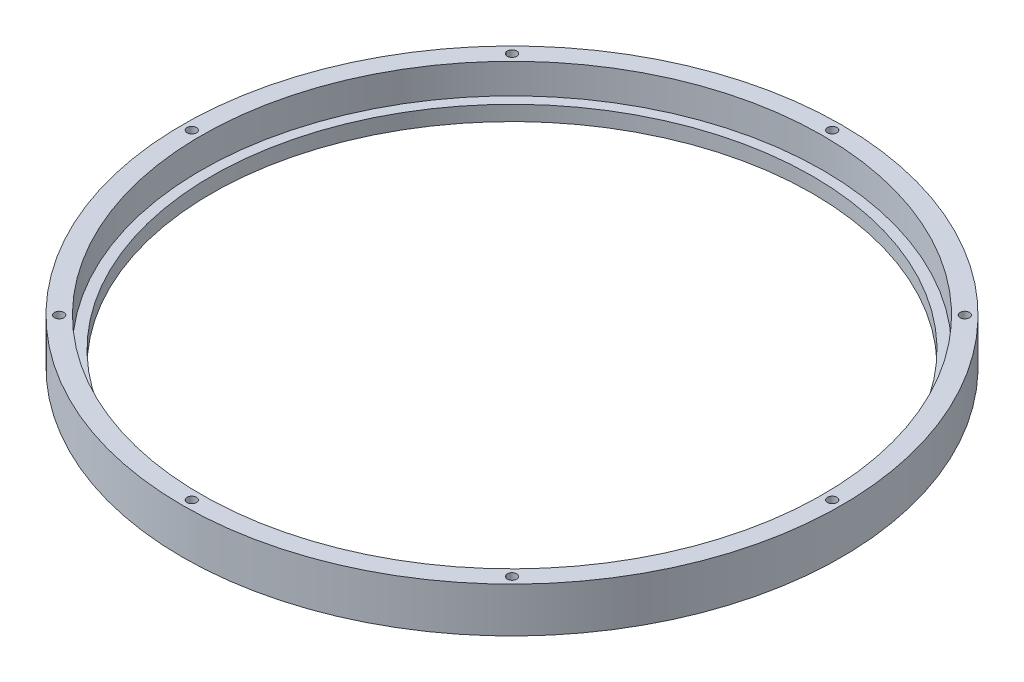
ISO-10303-21;
HEADER;
FILE_DESCRIPTION(('STEP AP214'),'2;1');
FILE_NAME('part.step','',(''),(''),'','','');
FILE_SCHEMA(('AUTOMOTIVE_DESIGN { 1 0 10303 214 1 1 1 1 }'));
ENDSEC;
DATA;
#1=APPLICATION_CONTEXT('core data for automotive mechanical design processes');
#2=APPLICATION_PROTOCOL_DEFINITION('international standard','automotive_design',2000,#1);
#3=PRODUCT_CONTEXT('',#1,'mechanical');
#4=PRODUCT('Part','Part','',(#3));
#5=PRODUCT_RELATED_PRODUCT_CATEGORY('part','',(#4));
#6=PRODUCT_DEFINITION_FORMATION('','',#4);
#7=PRODUCT_DEFINITION_CONTEXT('part definition',#1,'design');
#8=PRODUCT_DEFINITION('design','',#6,#7);
#9=PRODUCT_DEFINITION_SHAPE('','',#8);
#10=(LENGTH_UNIT() NAMED_UNIT(*) SI_UNIT(.MILLI.,.METRE.));
#11=(NAMED_UNIT(*) PLANE_ANGLE_UNIT() SI_UNIT($,.RADIAN.));
#12=(NAMED_UNIT(*) SI_UNIT($,.STERADIAN.) SOLID_ANGLE_UNIT());
#13=UNCERTAINTY_MEASURE_WITH_UNIT(LENGTH_MEASURE(1.E-05),#10,'distance_accuracy_value','');
#14=(GEOMETRIC_REPRESENTATION_CONTEXT(3) GLOBAL_UNCERTAINTY_ASSIGNED_CONTEXT((#13)) GLOBAL_UNIT_ASSIGNED_CONTEXT((#10,
#11,#12)) REPRESENTATION_CONTEXT('',''));
#15=CARTESIAN_POINT('',(0.,0.,0.));
#16=DIRECTION('',(0.,0.,1.));
#17=DIRECTION('',(1.,0.,0.));
#18=AXIS2_PLACEMENT_3D('',#15,#16,#17);
#19=CARTESIAN_POINT('',(88.,12.,0.));
#20=DIRECTION('',(0.,-1.,0.));
#21=DIRECTION('',(0.,0.,1.));
#22=AXIS2_PLACEMENT_3D('',#19,#20,#21);
#23=PLANE('',#22);
#24=CARTESIAN_POINT('',(-60.4576297914498,12.,60.4576297914498));
#25=DIRECTION('',(0.,-1.,0.));
#26=DIRECTION('',(0.,0.,-1.));
#27=AXIS2_PLACEMENT_3D('',#24,#25,#26);
#28=CIRCLE('',#27,1.25);
#29=CARTESIAN_POINT('',(-60.4576297914498,12.,59.2076297914498));
#30=VERTEX_POINT('',#29);
#31=EDGE_CURVE('E105',#30,#30,#28,.T.);
#32=ORIENTED_EDGE('',*,*,#31,.T.);
#33=EDGE_LOOP('',(#32));
#34=FACE_BOUND('',#33,.T.);
#35=CARTESIAN_POINT('',(-85.5,12.,0.));
#36=DIRECTION('',(0.,-1.,0.));
#37=DIRECTION('',(0.,0.,-1.));
#38=AXIS2_PLACEMENT_3D('',#35,#36,#37);
#39=CIRCLE('',#38,1.25);
#40=CARTESIAN_POINT('',(-85.5,12.,-1.25000000000002));
#41=VERTEX_POINT('',#40);
#42=EDGE_CURVE('E99',#41,#41,#39,.T.);
#43=ORIENTED_EDGE('',*,*,#42,.T.);
#44=EDGE_LOOP('',(#43));
#45=FACE_BOUND('',#44,.T.);
#46=CARTESIAN_POINT('',(0.,12.,85.5));
#47=DIRECTION('',(0.,-1.,0.));
#48=DIRECTION('',(0.,0.,-1.));
#49=AXIS2_PLACEMENT_3D('',#46,#47,#48);
#50=CIRCLE('',#49,1.25);
#51=CARTESIAN_POINT('',(0.,12.,84.25));
#52=VERTEX_POINT('',#51);
#53=EDGE_CURVE('E93',#52,#52,#50,.T.);
#54=ORIENTED_EDGE('',*,*,#53,.T.);
#55=EDGE_LOOP('',(#54));
#56=FACE_BOUND('',#55,.T.);
#57=CARTESIAN_POINT('',(60.4576297914498,12.,60.4576297914498));
#58=DIRECTION('',(0.,-1.,0.));
#59=DIRECTION('',(0.,0.,-1.));
#60=AXIS2_PLACEMENT_3D('',#57,#58,#59);
#61=CIRCLE('',#60,1.25);
#62=CARTESIAN_POINT('',(60.4576297914498,12.,59.2076297914498));
#63=VERTEX_POINT('',#62);
#64=EDGE_CURVE('E87',#63,#63,#61,.T.);
#65=ORIENTED_EDGE('',*,*,#64,.T.);
#66=EDGE_LOOP('',(#65));
#67=FACE_BOUND('',#66,.T.);
#68=CARTESIAN_POINT('',(85.5,12.,0.));
#69=DIRECTION('',(0.,-1.,0.));
#70=DIRECTION('',(0.,0.,-1.));
#71=AXIS2_PLACEMENT_3D('',#68,#69,#70);
#72=CIRCLE('',#71,1.25);
#73=CARTESIAN_POINT('',(85.5,12.,-1.25));
#74=VERTEX_POINT('',#73);
#75=EDGE_CURVE('E81',#74,#74,#72,.T.);
#76=ORIENTED_EDGE('',*,*,#75,.T.);
#77=EDGE_LOOP('',(#76));
#78=FACE_BOUND('',#77,.T.);
#79=CARTESIAN_POINT('',(60.4576297914498,12.,-60.4576297914498));
#80=DIRECTION('',(0.,-1.,0.));
#81=DIRECTION('',(0.,0.,-1.));
#82=AXIS2_PLACEMENT_3D('',#79,#80,#81);
#83=CIRCLE('',#82,1.25);
#84=CARTESIAN_POINT('',(60.4576297914498,12.,-61.7076297914498));
#85=VERTEX_POINT('',#84);
#86=EDGE_CURVE('E75',#85,#85,#83,.T.);
#87=ORIENTED_EDGE('',*,*,#86,.T.);
#88=EDGE_LOOP('',(#87));
#89=FACE_BOUND('',#88,.T.);
#90=CARTESIAN_POINT('',(-60.4576297914498,12.,-60.4576297914498));
#91=DIRECTION('',(0.,-1.,0.));
#92=DIRECTION('',(0.,0.,-1.));
#93=AXIS2_PLACEMENT_3D('',#90,#91,#92);
#94=CIRCLE('',#93,1.25);
#95=CARTESIAN_POINT('',(-60.4576297914498,12.,-61.7076297914498));
#96=VERTEX_POINT('',#95);
#97=EDGE_CURVE('E63',#96,#96,#94,.T.);
#98=ORIENTED_EDGE('',*,*,#97,.T.);
#99=EDGE_LOOP('',(#98));
#100=FACE_BOUND('',#99,.T.);
#101=CARTESIAN_POINT('',(0.,12.,0.));
#102=DIRECTION('',(0.,-1.,0.));
#103=DIRECTION('',(0.,0.,-1.));
#104=AXIS2_PLACEMENT_3D('',#101,#102,#103);
#105=CIRCLE('',#104,83.);
#106=CARTESIAN_POINT('',(0.,12.,-83.));
#107=VERTEX_POINT('',#106);
#108=EDGE_CURVE('E49',#107,#107,#105,.T.);
#109=ORIENTED_EDGE('',*,*,#108,.T.);
#110=EDGE_LOOP('',(#109));
#111=FACE_BOUND('',#110,.T.);
#112=CARTESIAN_POINT('',(0.,12.,0.));
#113=DIRECTION('',(0.,-1.,0.));
#114=DIRECTION('',(0.,0.,-1.));
#115=AXIS2_PLACEMENT_3D('',#112,#113,#114);
#116=CIRCLE('',#115,88.);
#117=CARTESIAN_POINT('',(0.,12.,-88.));
#118=VERTEX_POINT('',#117);
#119=EDGE_CURVE('E45',#118,#118,#116,.T.);
#120=ORIENTED_EDGE('',*,*,#119,.F.);
#121=EDGE_LOOP('',(#120));
#122=FACE_BOUND('',#121,.T.);
#123=CARTESIAN_POINT('',(0.,12.,-85.5));
#124=DIRECTION('',(0.,-1.,0.));
#125=DIRECTION('',(0.,0.,-1.));
#126=AXIS2_PLACEMENT_3D('',#123,#124,#125);
#127=CIRCLE('',#126,1.25);
#128=CARTESIAN_POINT('',(0.,12.,-86.75));
#129=VERTEX_POINT('',#128);
#130=EDGE_CURVE('E69',#129,#129,#127,.T.);
#131=ORIENTED_EDGE('',*,*,#130,.T.);
#132=EDGE_LOOP('',(#131));
#133=FACE_BOUND('',#132,.T.);
#134=ADVANCED_FACE('F34',(#34,#45,#56,#67,#78,#89,#100,#111,#122,#133),#23,.F.);
#135=CARTESIAN_POINT('',(0.,172.855093204078,0.));
#136=DIRECTION('',(0.,1.,0.));
#137=DIRECTION('',(0.,0.,-1.));
#138=AXIS2_PLACEMENT_3D('',#135,#136,#137);
#139=CYLINDRICAL_SURFACE('',#138,80.25);
#140=CARTESIAN_POINT('',(0.,0.,0.));
#141=DIRECTION('',(0.,-1.,0.));
#142=DIRECTION('',(0.,0.,-1.));
#143=AXIS2_PLACEMENT_3D('',#140,#141,#142);
#144=CIRCLE('',#143,80.25);
#145=CARTESIAN_POINT('',(0.,0.,-80.25));
#146=VERTEX_POINT('',#145);
#147=EDGE_CURVE('E10',#146,#146,#144,.T.);
#148=ORIENTED_EDGE('',*,*,#147,.T.);
#149=EDGE_LOOP('',(#148));
#150=FACE_BOUND('',#149,.T.);
#151=CARTESIAN_POINT('',(0.,4.,0.));
#152=DIRECTION('',(0.,-1.,0.));
#153=DIRECTION('',(0.,0.,-1.));
#154=AXIS2_PLACEMENT_3D('',#151,#152,#153);
#155=CIRCLE('',#154,80.25);
#156=CARTESIAN_POINT('',(0.,4.,-80.25));
#157=VERTEX_POINT('',#156);
#158=EDGE_CURVE('E57',#157,#157,#155,.T.);
#159=ORIENTED_EDGE('',*,*,#158,.F.);
#160=EDGE_LOOP('',(#159));
#161=FACE_BOUND('',#160,.T.);
#162=ADVANCED_FACE('F36',(#150,#161),#139,.F.);
#163=CARTESIAN_POINT('',(80.25,0.,0.));
#164=DIRECTION('',(0.,1.,0.));
#165=DIRECTION('',(0.,0.,-1.));
#166=AXIS2_PLACEMENT_3D('',#163,#164,#165);
#167=PLANE('',#166);
#168=CARTESIAN_POINT('',(-60.4576297914498,0.,60.4576297914498));
#169=DIRECTION('',(0.,-1.,0.));
#170=DIRECTION('',(0.,0.,-1.));
#171=AXIS2_PLACEMENT_3D('',#168,#169,#170);
#172=CIRCLE('',#171,1.24999999999999);
#173=CARTESIAN_POINT('',(-60.4576297914498,0.,59.2076297914498));
#174=VERTEX_POINT('',#173);
#175=EDGE_CURVE('E102',#174,#174,#172,.T.);
#176=ORIENTED_EDGE('',*,*,#175,.F.);
#177=EDGE_LOOP('',(#176));
#178=FACE_BOUND('',#177,.T.);
#179=CARTESIAN_POINT('',(-85.5,0.,0.));
#180=DIRECTION('',(0.,-1.,0.));
#181=DIRECTION('',(0.,0.,-1.));
#182=AXIS2_PLACEMENT_3D('',#179,#180,#181);
#183=CIRCLE('',#182,1.25);
#184=CARTESIAN_POINT('',(-85.5,0.,-1.25000000000002));
#185=VERTEX_POINT('',#184);
#186=EDGE_CURVE('E96',#185,#185,#183,.T.);
#187=ORIENTED_EDGE('',*,*,#186,.F.);
#188=EDGE_LOOP('',(#187));
#189=FACE_BOUND('',#188,.T.);
#190=CARTESIAN_POINT('',(0.,0.,85.5));
#191=DIRECTION('',(0.,-1.,0.));
#192=DIRECTION('',(0.,0.,-1.));
#193=AXIS2_PLACEMENT_3D('',#190,#191,#192);
#194=CIRCLE('',#193,1.25);
#195=CARTESIAN_POINT('',(0.,0.,84.25));
#196=VERTEX_POINT('',#195);
#197=EDGE_CURVE('E90',#196,#196,#194,.T.);
#198=ORIENTED_EDGE('',*,*,#197,.F.);
#199=EDGE_LOOP('',(#198));
#200=FACE_BOUND('',#199,.T.);
#201=CARTESIAN_POINT('',(60.4576297914498,0.,60.4576297914498));
#202=DIRECTION('',(0.,-1.,0.));
#203=DIRECTION('',(0.,0.,-1.));
#204=AXIS2_PLACEMENT_3D('',#201,#202,#203);
#205=CIRCLE('',#204,1.24999999999999);
#206=CARTESIAN_POINT('',(60.4576297914498,0.,59.2076297914498));
#207=VERTEX_POINT('',#206);
#208=EDGE_CURVE('E84',#207,#207,#205,.T.);
#209=ORIENTED_EDGE('',*,*,#208,.F.);
#210=EDGE_LOOP('',(#209));
#211=FACE_BOUND('',#210,.T.);
#212=CARTESIAN_POINT('',(85.5,0.,0.));
#213=DIRECTION('',(0.,-1.,0.));
#214=DIRECTION('',(0.,0.,-1.));
#215=AXIS2_PLACEMENT_3D('',#212,#213,#214);
#216=CIRCLE('',#215,1.25);
#217=CARTESIAN_POINT('',(85.5,0.,-1.25));
#218=VERTEX_POINT('',#217);
#219=EDGE_CURVE('E78',#218,#218,#216,.T.);
#220=ORIENTED_EDGE('',*,*,#219,.F.);
#221=EDGE_LOOP('',(#220));
#222=FACE_BOUND('',#221,.T.);
#223=CARTESIAN_POINT('',(60.4576297914498,0.,-60.4576297914498));
#224=DIRECTION('',(0.,-1.,0.));
#225=DIRECTION('',(0.,0.,-1.));
#226=AXIS2_PLACEMENT_3D('',#223,#224,#225);
#227=CIRCLE('',#226,1.24999999999999);
#228=CARTESIAN_POINT('',(60.4576297914498,0.,-61.7076297914498));
#229=VERTEX_POINT('',#228);
#230=EDGE_CURVE('E72',#229,#229,#227,.T.);
#231=ORIENTED_EDGE('',*,*,#230,.F.);
#232=EDGE_LOOP('',(#231));
#233=FACE_BOUND('',#232,.T.);
#234=CARTESIAN_POINT('',(0.,0.,-85.5));
#235=DIRECTION('',(0.,-1.,0.));
#236=DIRECTION('',(0.,0.,-1.));
#237=AXIS2_PLACEMENT_3D('',#234,#235,#236);
#238=CIRCLE('',#237,1.25);
#239=CARTESIAN_POINT('',(0.,0.,-86.75));
#240=VERTEX_POINT('',#239);
#241=EDGE_CURVE('E66',#240,#240,#238,.T.);
#242=ORIENTED_EDGE('',*,*,#241,.F.);
#243=EDGE_LOOP('',(#242));
#244=FACE_BOUND('',#243,.T.);
#245=CARTESIAN_POINT('',(-60.4576297914498,0.,-60.4576297914498));
#246=DIRECTION('',(0.,-1.,0.));
#247=DIRECTION('',(0.,0.,-1.));
#248=AXIS2_PLACEMENT_3D('',#245,#246,#247);
#249=CIRCLE('',#248,1.24999999999999);
#250=CARTESIAN_POINT('',(-60.4576297914498,0.,-61.7076297914498));
#251=VERTEX_POINT('',#250);
#252=EDGE_CURVE('E60',#251,#251,#249,.T.);
#253=ORIENTED_EDGE('',*,*,#252,.F.);
#254=EDGE_LOOP('',(#253));
#255=FACE_BOUND('',#254,.T.);
#256=CARTESIAN_POINT('',(0.,0.,0.));
#257=DIRECTION('',(0.,-1.,0.));
#258=DIRECTION('',(0.,0.,-1.));
#259=AXIS2_PLACEMENT_3D('',#256,#257,#258);
#260=CIRCLE('',#259,88.);
#261=CARTESIAN_POINT('',(0.,0.,-88.));
#262=VERTEX_POINT('',#261);
#263=EDGE_CURVE('E41',#262,#262,#260,.T.);
#264=ORIENTED_EDGE('',*,*,#263,.T.);
#265=EDGE_LOOP('',(#264));
#266=FACE_BOUND('',#265,.T.);
#267=ORIENTED_EDGE('',*,*,#147,.F.);
#268=EDGE_LOOP('',(#267));
#269=FACE_BOUND('',#268,.T.);
#270=ADVANCED_FACE('F127',(#178,#189,#200,#211,#222,#233,#244,#255,#266,#269),#167,.F.);
#271=CARTESIAN_POINT('',(0.,172.855093204078,0.));
#272=DIRECTION('',(0.,1.,0.));
#273=DIRECTION('',(0.,0.,-1.));
#274=AXIS2_PLACEMENT_3D('',#271,#272,#273);
#275=CYLINDRICAL_SURFACE('',#274,88.);
#276=ORIENTED_EDGE('',*,*,#119,.T.);
#277=EDGE_LOOP('',(#276));
#278=FACE_BOUND('',#277,.T.);
#279=ORIENTED_EDGE('',*,*,#263,.F.);
#280=EDGE_LOOP('',(#279));
#281=FACE_BOUND('',#280,.T.);
#282=ADVANCED_FACE('F132',(#278,#281),#275,.T.);
#283=CARTESIAN_POINT('',(0.,172.855093204078,0.));
#284=DIRECTION('',(0.,1.,0.));
#285=DIRECTION('',(0.,0.,-1.));
#286=AXIS2_PLACEMENT_3D('',#283,#284,#285);
#287=CYLINDRICAL_SURFACE('',#286,83.);
#288=CARTESIAN_POINT('',(0.,4.,0.));
#289=DIRECTION('',(0.,-1.,0.));
#290=DIRECTION('',(0.,0.,-1.));
#291=AXIS2_PLACEMENT_3D('',#288,#289,#290);
#292=CIRCLE('',#291,83.);
#293=CARTESIAN_POINT('',(0.,4.,-83.));
#294=VERTEX_POINT('',#293);
#295=EDGE_CURVE('E54',#294,#294,#292,.T.);
#296=ORIENTED_EDGE('',*,*,#295,.T.);
#297=EDGE_LOOP('',(#296));
#298=FACE_BOUND('',#297,.T.);
#299=ORIENTED_EDGE('',*,*,#108,.F.);
#300=EDGE_LOOP('',(#299));
#301=FACE_BOUND('',#300,.T.);
#302=ADVANCED_FACE('F130',(#298,#301),#287,.F.);
#303=CARTESIAN_POINT('',(83.,4.,0.));
#304=DIRECTION('',(0.,-1.,0.));
#305=DIRECTION('',(0.,0.,1.));
#306=AXIS2_PLACEMENT_3D('',#303,#304,#305);
#307=PLANE('',#306);
#308=ORIENTED_EDGE('',*,*,#158,.T.);
#309=EDGE_LOOP('',(#308));
#310=FACE_BOUND('',#309,.T.);
#311=ORIENTED_EDGE('',*,*,#295,.F.);
#312=EDGE_LOOP('',(#311));
#313=FACE_BOUND('',#312,.T.);
#314=ADVANCED_FACE('F160',(#310,#313),#307,.F.);
#315=CARTESIAN_POINT('',(-60.4576297914498,12.,-60.4576297914498));
#316=DIRECTION('',(0.,1.,0.));
#317=DIRECTION('',(0.,0.,-1.));
#318=AXIS2_PLACEMENT_3D('',#315,#316,#317);
#319=CYLINDRICAL_SURFACE('',#318,1.25);
#320=ORIENTED_EDGE('',*,*,#252,.T.);
#321=EDGE_LOOP('',(#320));
#322=FACE_BOUND('',#321,.T.);
#323=ORIENTED_EDGE('',*,*,#97,.F.);
#324=EDGE_LOOP('',(#323));
#325=FACE_BOUND('',#324,.T.);
#326=ADVANCED_FACE('F156',(#322,#325),#319,.F.);
#327=CARTESIAN_POINT('',(0.,12.,-85.5));
#328=DIRECTION('',(0.,1.,0.));
#329=DIRECTION('',(0.,0.,-1.));
#330=AXIS2_PLACEMENT_3D('',#327,#328,#329);
#331=CYLINDRICAL_SURFACE('',#330,1.25);
#332=ORIENTED_EDGE('',*,*,#241,.T.);
#333=EDGE_LOOP('',(#332));
#334=FACE_BOUND('',#333,.T.);
#335=ORIENTED_EDGE('',*,*,#130,.F.);
#336=EDGE_LOOP('',(#335));
#337=FACE_BOUND('',#336,.T.);
#338=ADVANCED_FACE('F159',(#334,#337),#331,.F.);
#339=CARTESIAN_POINT('',(60.4576297914498,12.,-60.4576297914498));
#340=DIRECTION('',(0.,1.,0.));
#341=DIRECTION('',(0.,0.,-1.));
#342=AXIS2_PLACEMENT_3D('',#339,#340,#341);
#343=CYLINDRICAL_SURFACE('',#342,1.25);
#344=ORIENTED_EDGE('',*,*,#230,.T.);
#345=EDGE_LOOP('',(#344));
#346=FACE_BOUND('',#345,.T.);
#347=ORIENTED_EDGE('',*,*,#86,.F.);
#348=EDGE_LOOP('',(#347));
#349=FACE_BOUND('',#348,.T.);
#350=ADVANCED_FACE('F172',(#346,#349),#343,.F.);
#351=CARTESIAN_POINT('',(85.5,12.,0.));
#352=DIRECTION('',(0.,1.,0.));
#353=DIRECTION('',(0.,0.,-1.));
#354=AXIS2_PLACEMENT_3D('',#351,#352,#353);
#355=CYLINDRICAL_SURFACE('',#354,1.25);
#356=ORIENTED_EDGE('',*,*,#219,.T.);
#357=EDGE_LOOP('',(#356));
#358=FACE_BOUND('',#357,.T.);
#359=ORIENTED_EDGE('',*,*,#75,.F.);
#360=EDGE_LOOP('',(#359));
#361=FACE_BOUND('',#360,.T.);
#362=ADVANCED_FACE('F178',(#358,#361),#355,.F.);
#363=CARTESIAN_POINT('',(60.4576297914498,12.,60.4576297914498));
#364=DIRECTION('',(0.,1.,0.));
#365=DIRECTION('',(0.,0.,-1.));
#366=AXIS2_PLACEMENT_3D('',#363,#364,#365);
#367=CYLINDRICAL_SURFACE('',#366,1.25);
#368=ORIENTED_EDGE('',*,*,#208,.T.);
#369=EDGE_LOOP('',(#368));
#370=FACE_BOUND('',#369,.T.);
#371=ORIENTED_EDGE('',*,*,#64,.F.);
#372=EDGE_LOOP('',(#371));
#373=FACE_BOUND('',#372,.T.);
#374=ADVANCED_FACE('F223',(#370,#373),#367,.F.);
#375=CARTESIAN_POINT('',(0.,12.,85.5));
#376=DIRECTION('',(0.,1.,0.));
#377=DIRECTION('',(0.,0.,-1.));
#378=AXIS2_PLACEMENT_3D('',#375,#376,#377);
#379=CYLINDRICAL_SURFACE('',#378,1.25);
#380=ORIENTED_EDGE('',*,*,#197,.T.);
#381=EDGE_LOOP('',(#380));
#382=FACE_BOUND('',#381,.T.);
#383=ORIENTED_EDGE('',*,*,#53,.F.);
#384=EDGE_LOOP('',(#383));
#385=FACE_BOUND('',#384,.T.);
#386=ADVANCED_FACE('F119',(#382,#385),#379,.F.);
#387=CARTESIAN_POINT('',(-85.5,12.,0.));
#388=DIRECTION('',(0.,1.,0.));
#389=DIRECTION('',(0.,0.,-1.));
#390=AXIS2_PLACEMENT_3D('',#387,#388,#389);
#391=CYLINDRICAL_SURFACE('',#390,1.25);
#392=ORIENTED_EDGE('',*,*,#186,.T.);
#393=EDGE_LOOP('',(#392));
#394=FACE_BOUND('',#393,.T.);
#395=ORIENTED_EDGE('',*,*,#42,.F.);
#396=EDGE_LOOP('',(#395));
#397=FACE_BOUND('',#396,.T.);
#398=ADVANCED_FACE('F113',(#394,#397),#391,.F.);
#399=CARTESIAN_POINT('',(-60.4576297914498,12.,60.4576297914498));
#400=DIRECTION('',(0.,1.,0.));
#401=DIRECTION('',(0.,0.,-1.));
#402=AXIS2_PLACEMENT_3D('',#399,#400,#401);
#403=CYLINDRICAL_SURFACE('',#402,1.25);
#404=ORIENTED_EDGE('',*,*,#175,.T.);
#405=EDGE_LOOP('',(#404));
#406=FACE_BOUND('',#405,.T.);
#407=ORIENTED_EDGE('',*,*,#31,.F.);
#408=EDGE_LOOP('',(#407));
#409=FACE_BOUND('',#408,.T.);
#410=ADVANCED_FACE('F111',(#406,#409),#403,.F.);
#411=CLOSED_SHELL('',(#134,#162,#270,#282,#302,#314,#326,#338,#350,#362,#374,#386,#398,#410));
#412=MANIFOLD_SOLID_BREP('B2',#411);
#413=ADVANCED_BREP_SHAPE_REPRESENTATION('',(#18,#412),#14);
#414=SHAPE_DEFINITION_REPRESENTATION(#9,#413);
ENDSEC;
END-ISO-10303-21;
